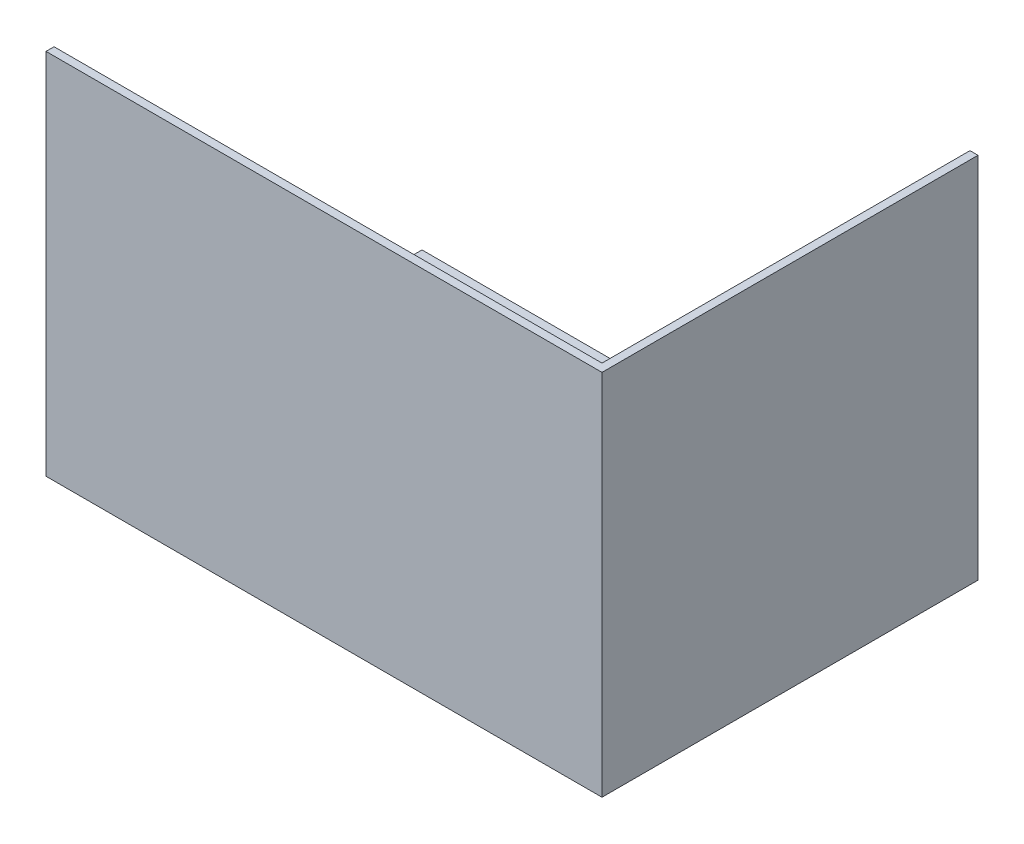
ISO-10303-21;
HEADER;
FILE_DESCRIPTION(('STEP AP214'),'2;1');
FILE_NAME('part.step','',(''),(''),'','','');
FILE_SCHEMA(('AUTOMOTIVE_DESIGN { 1 0 10303 214 1 1 1 1 }'));
ENDSEC;
DATA;
#1=APPLICATION_CONTEXT('core data for automotive mechanical design processes');
#2=APPLICATION_PROTOCOL_DEFINITION('international standard','automotive_design',2000,#1);
#3=PRODUCT_CONTEXT('',#1,'mechanical');
#4=PRODUCT('Part','Part','',(#3));
#5=PRODUCT_RELATED_PRODUCT_CATEGORY('part','',(#4));
#6=PRODUCT_DEFINITION_FORMATION('','',#4);
#7=PRODUCT_DEFINITION_CONTEXT('part definition',#1,'design');
#8=PRODUCT_DEFINITION('design','',#6,#7);
#9=PRODUCT_DEFINITION_SHAPE('','',#8);
#10=(LENGTH_UNIT() NAMED_UNIT(*) SI_UNIT(.MILLI.,.METRE.));
#11=(NAMED_UNIT(*) PLANE_ANGLE_UNIT() SI_UNIT($,.RADIAN.));
#12=(NAMED_UNIT(*) SI_UNIT($,.STERADIAN.) SOLID_ANGLE_UNIT());
#13=UNCERTAINTY_MEASURE_WITH_UNIT(LENGTH_MEASURE(1.E-05),#10,'distance_accuracy_value','');
#14=(GEOMETRIC_REPRESENTATION_CONTEXT(3) GLOBAL_UNCERTAINTY_ASSIGNED_CONTEXT((#13)) GLOBAL_UNIT_ASSIGNED_CONTEXT((#10,
#11,#12)) REPRESENTATION_CONTEXT('',''));
#15=CARTESIAN_POINT('',(0.,0.,0.));
#16=DIRECTION('',(0.,0.,1.));
#17=DIRECTION('',(1.,0.,0.));
#18=AXIS2_PLACEMENT_3D('',#15,#16,#17);
#19=CARTESIAN_POINT('',(0.,3.4036,0.));
#20=DIRECTION('',(1.,0.,0.));
#21=DIRECTION('',(0.,0.,-1.));
#22=AXIS2_PLACEMENT_3D('',#19,#20,#21);
#23=PLANE('',#22);
#24=DIRECTION('',(0.,0.,1.));
#25=VECTOR('',#24,1.);
#26=CARTESIAN_POINT('',(0.,0.,0.));
#27=LINE('',#26,#25);
#28=CARTESIAN_POINT('',(0.,0.,-159.2072));
#29=VERTEX_POINT('',#28);
#30=CARTESIAN_POINT('',(0.,0.,0.));
#31=VERTEX_POINT('',#30);
#32=EDGE_CURVE('E114',#29,#31,#27,.T.);
#33=ORIENTED_EDGE('',*,*,#32,.T.);
#34=DIRECTION('',(0.,-1.,0.));
#35=VECTOR('',#34,1.);
#36=CARTESIAN_POINT('',(0.,3.4036,0.));
#37=LINE('',#36,#35);
#38=CARTESIAN_POINT('',(0.,155.8036,0.));
#39=VERTEX_POINT('',#38);
#40=EDGE_CURVE('E11',#39,#31,#37,.T.);
#41=ORIENTED_EDGE('',*,*,#40,.F.);
#42=DIRECTION('',(0.,0.,1.));
#43=VECTOR('',#42,1.);
#44=CARTESIAN_POINT('',(0.,155.8036,-3.4036));
#45=LINE('',#44,#43);
#46=CARTESIAN_POINT('',(0.,155.8036,-3.4036));
#47=VERTEX_POINT('',#46);
#48=EDGE_CURVE('E176',#47,#39,#45,.T.);
#49=ORIENTED_EDGE('',*,*,#48,.F.);
#50=DIRECTION('',(0.,-1.,0.));
#51=VECTOR('',#50,1.);
#52=CARTESIAN_POINT('',(0.,155.8036,-3.4036));
#53=LINE('',#52,#51);
#54=CARTESIAN_POINT('',(0.,3.4036,-3.4036));
#55=VERTEX_POINT('',#54);
#56=EDGE_CURVE('E168',#47,#55,#53,.T.);
#57=ORIENTED_EDGE('',*,*,#56,.T.);
#58=DIRECTION('',(0.,0.,1.));
#59=VECTOR('',#58,1.);
#60=CARTESIAN_POINT('',(0.,3.4036,0.));
#61=LINE('',#60,#59);
#62=CARTESIAN_POINT('',(0.,3.4036,-159.2072));
#63=VERTEX_POINT('',#62);
#64=EDGE_CURVE('E116',#63,#55,#61,.T.);
#65=ORIENTED_EDGE('',*,*,#64,.F.);
#66=DIRECTION('',(0.,-1.,0.));
#67=VECTOR('',#66,1.);
#68=CARTESIAN_POINT('',(0.,3.4036,-159.2072));
#69=LINE('',#68,#67);
#70=EDGE_CURVE('E109',#63,#29,#69,.T.);
#71=ORIENTED_EDGE('',*,*,#70,.T.);
#72=EDGE_LOOP('',(#33,#41,#49,#57,#65,#71));
#73=FACE_BOUND('',#72,.T.);
#74=ADVANCED_FACE('F45',(#73),#23,.F.);
#75=CARTESIAN_POINT('',(0.,3.4036,0.));
#76=DIRECTION('',(0.,0.,-1.));
#77=DIRECTION('',(-1.,0.,0.));
#78=AXIS2_PLACEMENT_3D('',#75,#76,#77);
#79=PLANE('',#78);
#80=DIRECTION('',(1.,0.,0.));
#81=VECTOR('',#80,1.);
#82=CARTESIAN_POINT('',(0.,0.,0.));
#83=LINE('',#82,#81);
#84=CARTESIAN_POINT('',(235.4072,0.,0.));
#85=VERTEX_POINT('',#84);
#86=EDGE_CURVE('E100',#31,#85,#83,.T.);
#87=ORIENTED_EDGE('',*,*,#86,.T.);
#88=DIRECTION('',(0.,-1.,0.));
#89=VECTOR('',#88,1.);
#90=CARTESIAN_POINT('',(235.4072,3.4036,0.));
#91=LINE('',#90,#89);
#92=CARTESIAN_POINT('',(235.4072,155.8036,0.));
#93=VERTEX_POINT('',#92);
#94=EDGE_CURVE('E53',#93,#85,#91,.T.);
#95=ORIENTED_EDGE('',*,*,#94,.F.);
#96=DIRECTION('',(1.,0.,0.));
#97=VECTOR('',#96,1.);
#98=CARTESIAN_POINT('',(0.,155.8036,0.));
#99=LINE('',#98,#97);
#100=EDGE_CURVE('E137',#39,#93,#99,.T.);
#101=ORIENTED_EDGE('',*,*,#100,.F.);
#102=ORIENTED_EDGE('',*,*,#40,.T.);
#103=EDGE_LOOP('',(#87,#95,#101,#102));
#104=FACE_BOUND('',#103,.T.);
#105=ADVANCED_FACE('F131',(#104),#79,.F.);
#106=CARTESIAN_POINT('',(235.4072,3.4036,0.));
#107=DIRECTION('',(-1.,0.,0.));
#108=DIRECTION('',(0.,0.,1.));
#109=AXIS2_PLACEMENT_3D('',#106,#107,#108);
#110=PLANE('',#109);
#111=DIRECTION('',(0.,0.,-1.));
#112=VECTOR('',#111,1.);
#113=CARTESIAN_POINT('',(235.4072,0.,0.));
#114=LINE('',#113,#112);
#115=CARTESIAN_POINT('',(235.4072,0.,-159.2072));
#116=VERTEX_POINT('',#115);
#117=EDGE_CURVE('E88',#85,#116,#114,.T.);
#118=ORIENTED_EDGE('',*,*,#117,.T.);
#119=DIRECTION('',(0.,-1.,0.));
#120=VECTOR('',#119,1.);
#121=CARTESIAN_POINT('',(235.4072,3.4036,-159.2072));
#122=LINE('',#121,#120);
#123=CARTESIAN_POINT('',(235.4072,155.8036,-159.2072));
#124=VERTEX_POINT('',#123);
#125=EDGE_CURVE('E93',#124,#116,#122,.T.);
#126=ORIENTED_EDGE('',*,*,#125,.F.);
#127=DIRECTION('',(0.,0.,-1.));
#128=VECTOR('',#127,1.);
#129=CARTESIAN_POINT('',(235.4072,155.8036,-3.4036));
#130=LINE('',#129,#128);
#131=EDGE_CURVE('E153',#93,#124,#130,.T.);
#132=ORIENTED_EDGE('',*,*,#131,.F.);
#133=ORIENTED_EDGE('',*,*,#94,.T.);
#134=EDGE_LOOP('',(#118,#126,#132,#133));
#135=FACE_BOUND('',#134,.T.);
#136=ADVANCED_FACE('F90',(#135),#110,.F.);
#137=CARTESIAN_POINT('',(0.,3.4036,-159.2072));
#138=DIRECTION('',(0.,0.,1.));
#139=DIRECTION('',(1.,0.,0.));
#140=AXIS2_PLACEMENT_3D('',#137,#138,#139);
#141=PLANE('',#140);
#142=DIRECTION('',(-1.,0.,0.));
#143=VECTOR('',#142,1.);
#144=CARTESIAN_POINT('',(0.,0.,-159.2072));
#145=LINE('',#144,#143);
#146=EDGE_CURVE('E99',#116,#29,#145,.T.);
#147=ORIENTED_EDGE('',*,*,#146,.T.);
#148=ORIENTED_EDGE('',*,*,#70,.F.);
#149=DIRECTION('',(-1.,0.,0.));
#150=VECTOR('',#149,1.);
#151=CARTESIAN_POINT('',(0.,3.4036,-159.2072));
#152=LINE('',#151,#150);
#153=CARTESIAN_POINT('',(232.0036,3.4036,-159.2072));
#154=VERTEX_POINT('',#153);
#155=EDGE_CURVE('E68',#154,#63,#152,.T.);
#156=ORIENTED_EDGE('',*,*,#155,.F.);
#157=DIRECTION('',(0.,-1.,0.));
#158=VECTOR('',#157,1.);
#159=CARTESIAN_POINT('',(232.0036,155.8036,-159.2072));
#160=LINE('',#159,#158);
#161=CARTESIAN_POINT('',(232.0036,155.8036,-159.2072));
#162=VERTEX_POINT('',#161);
#163=EDGE_CURVE('E60',#162,#154,#160,.T.);
#164=ORIENTED_EDGE('',*,*,#163,.F.);
#165=DIRECTION('',(1.,0.,0.));
#166=VECTOR('',#165,1.);
#167=CARTESIAN_POINT('',(232.0036,155.8036,-159.2072));
#168=LINE('',#167,#166);
#169=EDGE_CURVE('E107',#162,#124,#168,.T.);
#170=ORIENTED_EDGE('',*,*,#169,.T.);
#171=ORIENTED_EDGE('',*,*,#125,.T.);
#172=EDGE_LOOP('',(#147,#148,#156,#164,#170,#171));
#173=FACE_BOUND('',#172,.T.);
#174=ADVANCED_FACE('F104',(#173),#141,.F.);
#175=CARTESIAN_POINT('',(0.,3.4036,0.));
#176=DIRECTION('',(0.,-1.,0.));
#177=DIRECTION('',(0.,0.,-1.));
#178=AXIS2_PLACEMENT_3D('',#175,#176,#177);
#179=PLANE('',#178);
#180=ORIENTED_EDGE('',*,*,#64,.T.);
#181=DIRECTION('',(1.,0.,0.));
#182=VECTOR('',#181,1.);
#183=CARTESIAN_POINT('',(0.,3.4036,-3.4036));
#184=LINE('',#183,#182);
#185=CARTESIAN_POINT('',(232.0036,3.4036,-3.4036));
#186=VERTEX_POINT('',#185);
#187=EDGE_CURVE('E173',#55,#186,#184,.T.);
#188=ORIENTED_EDGE('',*,*,#187,.T.);
#189=DIRECTION('',(0.,0.,-1.));
#190=VECTOR('',#189,1.);
#191=CARTESIAN_POINT('',(232.0036,3.4036,-3.4036));
#192=LINE('',#191,#190);
#193=EDGE_CURVE('E166',#186,#154,#192,.T.);
#194=ORIENTED_EDGE('',*,*,#193,.T.);
#195=ORIENTED_EDGE('',*,*,#155,.T.);
#196=EDGE_LOOP('',(#180,#188,#194,#195));
#197=FACE_BOUND('',#196,.T.);
#198=ADVANCED_FACE('F188',(#197),#179,.F.);
#199=CARTESIAN_POINT('',(0.,0.,0.));
#200=DIRECTION('',(0.,-1.,0.));
#201=DIRECTION('',(0.,0.,-1.));
#202=AXIS2_PLACEMENT_3D('',#199,#200,#201);
#203=PLANE('',#202);
#204=ORIENTED_EDGE('',*,*,#32,.F.);
#205=ORIENTED_EDGE('',*,*,#146,.F.);
#206=ORIENTED_EDGE('',*,*,#117,.F.);
#207=ORIENTED_EDGE('',*,*,#86,.F.);
#208=EDGE_LOOP('',(#204,#205,#206,#207));
#209=FACE_BOUND('',#208,.T.);
#210=ADVANCED_FACE('F112',(#209),#203,.T.);
#211=CARTESIAN_POINT('',(232.0036,155.8036,-3.4036));
#212=DIRECTION('',(-1.,0.,0.));
#213=DIRECTION('',(0.,0.,1.));
#214=AXIS2_PLACEMENT_3D('',#211,#212,#213);
#215=PLANE('',#214);
#216=ORIENTED_EDGE('',*,*,#193,.F.);
#217=DIRECTION('',(0.,-1.,0.));
#218=VECTOR('',#217,1.);
#219=CARTESIAN_POINT('',(232.0036,155.8036,-3.4036));
#220=LINE('',#219,#218);
#221=CARTESIAN_POINT('',(232.0036,155.8036,-3.4036));
#222=VERTEX_POINT('',#221);
#223=EDGE_CURVE('E146',#222,#186,#220,.T.);
#224=ORIENTED_EDGE('',*,*,#223,.F.);
#225=DIRECTION('',(0.,0.,-1.));
#226=VECTOR('',#225,1.);
#227=CARTESIAN_POINT('',(232.0036,155.8036,-3.4036));
#228=LINE('',#227,#226);
#229=EDGE_CURVE('E152',#222,#162,#228,.T.);
#230=ORIENTED_EDGE('',*,*,#229,.T.);
#231=ORIENTED_EDGE('',*,*,#163,.T.);
#232=EDGE_LOOP('',(#216,#224,#230,#231));
#233=FACE_BOUND('',#232,.T.);
#234=ADVANCED_FACE('F157',(#233),#215,.T.);
#235=CARTESIAN_POINT('',(0.,155.8036,0.));
#236=DIRECTION('',(0.,-1.,0.));
#237=DIRECTION('',(0.,0.,-1.));
#238=AXIS2_PLACEMENT_3D('',#235,#236,#237);
#239=PLANE('',#238);
#240=ORIENTED_EDGE('',*,*,#131,.T.);
#241=ORIENTED_EDGE('',*,*,#169,.F.);
#242=ORIENTED_EDGE('',*,*,#229,.F.);
#243=DIRECTION('',(1.,0.,0.));
#244=VECTOR('',#243,1.);
#245=CARTESIAN_POINT('',(0.,155.8036,-3.4036));
#246=LINE('',#245,#244);
#247=EDGE_CURVE('E170',#47,#222,#246,.T.);
#248=ORIENTED_EDGE('',*,*,#247,.F.);
#249=ORIENTED_EDGE('',*,*,#48,.T.);
#250=ORIENTED_EDGE('',*,*,#100,.T.);
#251=EDGE_LOOP('',(#240,#241,#242,#248,#249,#250));
#252=FACE_BOUND('',#251,.T.);
#253=ADVANCED_FACE('F150',(#252),#239,.F.);
#254=CARTESIAN_POINT('',(0.,155.8036,-3.4036));
#255=DIRECTION('',(0.,0.,-1.));
#256=DIRECTION('',(-1.,0.,0.));
#257=AXIS2_PLACEMENT_3D('',#254,#255,#256);
#258=PLANE('',#257);
#259=ORIENTED_EDGE('',*,*,#247,.T.);
#260=ORIENTED_EDGE('',*,*,#223,.T.);
#261=ORIENTED_EDGE('',*,*,#187,.F.);
#262=ORIENTED_EDGE('',*,*,#56,.F.);
#263=EDGE_LOOP('',(#259,#260,#261,#262));
#264=FACE_BOUND('',#263,.T.);
#265=ADVANCED_FACE('F186',(#264),#258,.T.);
#266=CLOSED_SHELL('',(#74,#105,#136,#174,#198,#210,#234,#253,#265));
#267=MANIFOLD_SOLID_BREP('B2',#266);
#268=ADVANCED_BREP_SHAPE_REPRESENTATION('',(#18,#267),#14);
#269=SHAPE_DEFINITION_REPRESENTATION(#9,#268);
ENDSEC;
END-ISO-10303-21;
